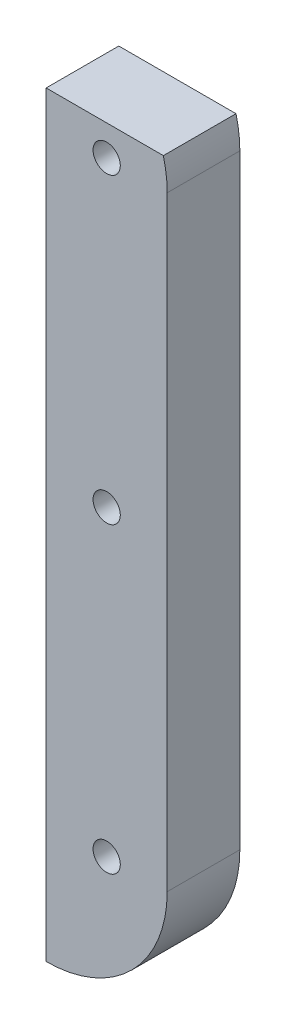
ISO-10303-21;
HEADER;
FILE_DESCRIPTION(('STEP AP214'),'2;1');
FILE_NAME('part.step','',(''),(''),'','','');
FILE_SCHEMA(('AUTOMOTIVE_DESIGN { 1 0 10303 214 1 1 1 1 }'));
ENDSEC;
DATA;
#1=APPLICATION_CONTEXT('core data for automotive mechanical design processes');
#2=APPLICATION_PROTOCOL_DEFINITION('international standard','automotive_design',2000,#1);
#3=PRODUCT_CONTEXT('',#1,'mechanical');
#4=PRODUCT('Part','Part','',(#3));
#5=PRODUCT_RELATED_PRODUCT_CATEGORY('part','',(#4));
#6=PRODUCT_DEFINITION_FORMATION('','',#4);
#7=PRODUCT_DEFINITION_CONTEXT('part definition',#1,'design');
#8=PRODUCT_DEFINITION('design','',#6,#7);
#9=PRODUCT_DEFINITION_SHAPE('','',#8);
#10=(LENGTH_UNIT() NAMED_UNIT(*) SI_UNIT(.MILLI.,.METRE.));
#11=(NAMED_UNIT(*) PLANE_ANGLE_UNIT() SI_UNIT($,.RADIAN.));
#12=(NAMED_UNIT(*) SI_UNIT($,.STERADIAN.) SOLID_ANGLE_UNIT());
#13=UNCERTAINTY_MEASURE_WITH_UNIT(LENGTH_MEASURE(1.E-05),#10,'distance_accuracy_value','');
#14=(GEOMETRIC_REPRESENTATION_CONTEXT(3) GLOBAL_UNCERTAINTY_ASSIGNED_CONTEXT((#13)) GLOBAL_UNIT_ASSIGNED_CONTEXT((#10,
#11,#12)) REPRESENTATION_CONTEXT('',''));
#15=CARTESIAN_POINT('',(0.,0.,0.));
#16=DIRECTION('',(0.,0.,1.));
#17=DIRECTION('',(1.,0.,0.));
#18=AXIS2_PLACEMENT_3D('',#15,#16,#17);
#19=CARTESIAN_POINT('',(0.,0.,12.));
#20=DIRECTION('',(0.,0.,1.));
#21=DIRECTION('',(1.,0.,0.));
#22=AXIS2_PLACEMENT_3D('',#19,#20,#21);
#23=PLANE('',#22);
#24=DIRECTION('',(1.,0.,0.));
#25=VECTOR('',#24,1.);
#26=CARTESIAN_POINT('',(-10.,55.,12.));
#27=LINE('',#26,#25);
#28=CARTESIAN_POINT('',(-10.,55.,12.));
#29=VERTEX_POINT('',#28);
#30=CARTESIAN_POINT('',(9.36491673103709,55.,12.));
#31=VERTEX_POINT('',#30);
#32=EDGE_CURVE('E54',#29,#31,#27,.T.);
#33=ORIENTED_EDGE('',*,*,#32,.F.);
#34=DIRECTION('',(0.,-1.,0.));
#35=VECTOR('',#34,1.);
#36=CARTESIAN_POINT('',(-10.,70.,12.));
#37=LINE('',#36,#35);
#38=CARTESIAN_POINT('',(-9.99999999999999,-70.,12.));
#39=VERTEX_POINT('',#38);
#40=EDGE_CURVE('E100',#29,#39,#37,.T.);
#41=ORIENTED_EDGE('',*,*,#40,.T.);
#42=CARTESIAN_POINT('',(-10.,-50.,12.));
#43=DIRECTION('',(0.,0.,1.));
#44=DIRECTION('',(1.,0.,0.));
#45=AXIS2_PLACEMENT_3D('',#42,#43,#44);
#46=CIRCLE('',#45,20.);
#47=CARTESIAN_POINT('',(10.,-50.,12.));
#48=VERTEX_POINT('',#47);
#49=EDGE_CURVE('E11',#39,#48,#46,.T.);
#50=ORIENTED_EDGE('',*,*,#49,.T.);
#51=DIRECTION('',(0.,1.,0.));
#52=VECTOR('',#51,1.);
#53=CARTESIAN_POINT('',(9.99999999999999,70.0000000000001,12.));
#54=LINE('',#53,#52);
#55=CARTESIAN_POINT('',(9.99999999999999,50.,12.));
#56=VERTEX_POINT('',#55);
#57=EDGE_CURVE('E107',#48,#56,#54,.T.);
#58=ORIENTED_EDGE('',*,*,#57,.T.);
#59=CARTESIAN_POINT('',(-10.,50.,12.));
#60=DIRECTION('',(0.,0.,1.));
#61=DIRECTION('',(1.,0.,0.));
#62=AXIS2_PLACEMENT_3D('',#59,#60,#61);
#63=CIRCLE('',#62,20.);
#64=EDGE_CURVE('E47',#56,#31,#63,.T.);
#65=ORIENTED_EDGE('',*,*,#64,.T.);
#66=EDGE_LOOP('',(#33,#41,#50,#58,#65));
#67=FACE_BOUND('',#66,.T.);
#68=CARTESIAN_POINT('',(0.,0.,12.));
#69=DIRECTION('',(0.,0.,1.));
#70=DIRECTION('',(1.,0.,0.));
#71=AXIS2_PLACEMENT_3D('',#68,#69,#70);
#72=CIRCLE('',#71,2.25);
#73=CARTESIAN_POINT('',(2.24999999999999,0.,12.));
#74=VERTEX_POINT('',#73);
#75=EDGE_CURVE('E138',#74,#74,#72,.T.);
#76=ORIENTED_EDGE('',*,*,#75,.F.);
#77=EDGE_LOOP('',(#76));
#78=FACE_BOUND('',#77,.T.);
#79=CARTESIAN_POINT('',(0.,-50.,12.));
#80=DIRECTION('',(0.,0.,1.));
#81=DIRECTION('',(1.,0.,0.));
#82=AXIS2_PLACEMENT_3D('',#79,#80,#81);
#83=CIRCLE('',#82,2.25);
#84=CARTESIAN_POINT('',(2.24999999999999,-50.,12.));
#85=VERTEX_POINT('',#84);
#86=EDGE_CURVE('E111',#85,#85,#83,.T.);
#87=ORIENTED_EDGE('',*,*,#86,.F.);
#88=EDGE_LOOP('',(#87));
#89=FACE_BOUND('',#88,.T.);
#90=CARTESIAN_POINT('',(0.,50.,12.));
#91=DIRECTION('',(0.,0.,1.));
#92=DIRECTION('',(1.,0.,0.));
#93=AXIS2_PLACEMENT_3D('',#90,#91,#92);
#94=CIRCLE('',#93,2.25);
#95=CARTESIAN_POINT('',(2.24999999999999,50.,12.));
#96=VERTEX_POINT('',#95);
#97=EDGE_CURVE('E131',#96,#96,#94,.T.);
#98=ORIENTED_EDGE('',*,*,#97,.F.);
#99=EDGE_LOOP('',(#98));
#100=FACE_BOUND('',#99,.T.);
#101=ADVANCED_FACE('F39',(#67,#78,#89,#100),#23,.T.);
#102=CARTESIAN_POINT('',(0.,0.,0.));
#103=DIRECTION('',(0.,0.,1.));
#104=DIRECTION('',(1.,0.,0.));
#105=AXIS2_PLACEMENT_3D('',#102,#103,#104);
#106=PLANE('',#105);
#107=DIRECTION('',(0.,-1.,0.));
#108=VECTOR('',#107,1.);
#109=CARTESIAN_POINT('',(-10.,70.,0.));
#110=LINE('',#109,#108);
#111=CARTESIAN_POINT('',(-10.,55.,0.));
#112=VERTEX_POINT('',#111);
#113=CARTESIAN_POINT('',(-9.99999999999999,-70.,0.));
#114=VERTEX_POINT('',#113);
#115=EDGE_CURVE('E98',#112,#114,#110,.T.);
#116=ORIENTED_EDGE('',*,*,#115,.F.);
#117=DIRECTION('',(1.,0.,0.));
#118=VECTOR('',#117,1.);
#119=CARTESIAN_POINT('',(-10.,55.,0.));
#120=LINE('',#119,#118);
#121=CARTESIAN_POINT('',(9.36491673103709,55.,0.));
#122=VERTEX_POINT('',#121);
#123=EDGE_CURVE('E85',#112,#122,#120,.T.);
#124=ORIENTED_EDGE('',*,*,#123,.T.);
#125=CARTESIAN_POINT('',(-10.,50.,0.));
#126=DIRECTION('',(0.,0.,1.));
#127=DIRECTION('',(1.,0.,0.));
#128=AXIS2_PLACEMENT_3D('',#125,#126,#127);
#129=CIRCLE('',#128,20.);
#130=CARTESIAN_POINT('',(9.99999999999999,50.,0.));
#131=VERTEX_POINT('',#130);
#132=EDGE_CURVE('E121',#122,#131,#129,.F.);
#133=ORIENTED_EDGE('',*,*,#132,.T.);
#134=DIRECTION('',(0.,1.,0.));
#135=VECTOR('',#134,1.);
#136=CARTESIAN_POINT('',(9.99999999999999,70.0000000000001,0.));
#137=LINE('',#136,#135);
#138=CARTESIAN_POINT('',(10.,-50.,0.));
#139=VERTEX_POINT('',#138);
#140=EDGE_CURVE('E108',#139,#131,#137,.T.);
#141=ORIENTED_EDGE('',*,*,#140,.F.);
#142=CARTESIAN_POINT('',(-10.,-50.,0.));
#143=DIRECTION('',(0.,0.,1.));
#144=DIRECTION('',(1.,0.,0.));
#145=AXIS2_PLACEMENT_3D('',#142,#143,#144);
#146=CIRCLE('',#145,20.);
#147=EDGE_CURVE('E105',#139,#114,#146,.F.);
#148=ORIENTED_EDGE('',*,*,#147,.T.);
#149=EDGE_LOOP('',(#116,#124,#133,#141,#148));
#150=FACE_BOUND('',#149,.T.);
#151=CARTESIAN_POINT('',(0.,-50.,0.));
#152=DIRECTION('',(0.,0.,1.));
#153=DIRECTION('',(1.,0.,0.));
#154=AXIS2_PLACEMENT_3D('',#151,#152,#153);
#155=CIRCLE('',#154,2.25);
#156=CARTESIAN_POINT('',(2.24999999999999,-50.,0.));
#157=VERTEX_POINT('',#156);
#158=EDGE_CURVE('E141',#157,#157,#155,.T.);
#159=ORIENTED_EDGE('',*,*,#158,.T.);
#160=EDGE_LOOP('',(#159));
#161=FACE_BOUND('',#160,.T.);
#162=CARTESIAN_POINT('',(0.,0.,0.));
#163=DIRECTION('',(0.,0.,1.));
#164=DIRECTION('',(1.,0.,0.));
#165=AXIS2_PLACEMENT_3D('',#162,#163,#164);
#166=CIRCLE('',#165,2.25);
#167=CARTESIAN_POINT('',(2.24999999999999,0.,0.));
#168=VERTEX_POINT('',#167);
#169=EDGE_CURVE('E136',#168,#168,#166,.T.);
#170=ORIENTED_EDGE('',*,*,#169,.T.);
#171=EDGE_LOOP('',(#170));
#172=FACE_BOUND('',#171,.T.);
#173=CARTESIAN_POINT('',(0.,50.,0.));
#174=DIRECTION('',(0.,0.,1.));
#175=DIRECTION('',(1.,0.,0.));
#176=AXIS2_PLACEMENT_3D('',#173,#174,#175);
#177=CIRCLE('',#176,2.25);
#178=CARTESIAN_POINT('',(2.24999999999999,50.,0.));
#179=VERTEX_POINT('',#178);
#180=EDGE_CURVE('E128',#179,#179,#177,.T.);
#181=ORIENTED_EDGE('',*,*,#180,.T.);
#182=EDGE_LOOP('',(#181));
#183=FACE_BOUND('',#182,.T.);
#184=ADVANCED_FACE('F102',(#150,#161,#172,#183),#106,.F.);
#185=CARTESIAN_POINT('',(9.99999999999999,70.0000000000001,12.));
#186=DIRECTION('',(-1.,0.,0.));
#187=DIRECTION('',(0.,-1.,0.));
#188=AXIS2_PLACEMENT_3D('',#185,#186,#187);
#189=PLANE('',#188);
#190=ORIENTED_EDGE('',*,*,#57,.F.);
#191=DIRECTION('',(0.,0.,-1.));
#192=VECTOR('',#191,1.);
#193=CARTESIAN_POINT('',(10.,-50.,12.));
#194=LINE('',#193,#192);
#195=EDGE_CURVE('E118',#48,#139,#194,.T.);
#196=ORIENTED_EDGE('',*,*,#195,.T.);
#197=ORIENTED_EDGE('',*,*,#140,.T.);
#198=DIRECTION('',(0.,0.,-1.));
#199=VECTOR('',#198,1.);
#200=CARTESIAN_POINT('',(9.99999999999999,50.,12.));
#201=LINE('',#200,#199);
#202=EDGE_CURVE('E62',#131,#56,#201,.F.);
#203=ORIENTED_EDGE('',*,*,#202,.T.);
#204=EDGE_LOOP('',(#190,#196,#197,#203));
#205=FACE_BOUND('',#204,.T.);
#206=ADVANCED_FACE('F151',(#205),#189,.F.);
#207=CARTESIAN_POINT('',(-10.,70.,12.));
#208=DIRECTION('',(1.,0.,0.));
#209=DIRECTION('',(0.,1.,0.));
#210=AXIS2_PLACEMENT_3D('',#207,#208,#209);
#211=PLANE('',#210);
#212=ORIENTED_EDGE('',*,*,#40,.F.);
#213=DIRECTION('',(0.,0.,1.));
#214=VECTOR('',#213,1.);
#215=CARTESIAN_POINT('',(-10.,55.,0.));
#216=LINE('',#215,#214);
#217=EDGE_CURVE('E88',#112,#29,#216,.T.);
#218=ORIENTED_EDGE('',*,*,#217,.F.);
#219=ORIENTED_EDGE('',*,*,#115,.T.);
#220=DIRECTION('',(0.,0.,-1.));
#221=VECTOR('',#220,1.);
#222=CARTESIAN_POINT('',(-9.99999999999999,-70.,12.));
#223=LINE('',#222,#221);
#224=EDGE_CURVE('E115',#39,#114,#223,.T.);
#225=ORIENTED_EDGE('',*,*,#224,.F.);
#226=EDGE_LOOP('',(#212,#218,#219,#225));
#227=FACE_BOUND('',#226,.T.);
#228=ADVANCED_FACE('F96',(#227),#211,.F.);
#229=CARTESIAN_POINT('',(0.,-50.,12.));
#230=DIRECTION('',(0.,0.,-1.));
#231=DIRECTION('',(-1.,0.,0.));
#232=AXIS2_PLACEMENT_3D('',#229,#230,#231);
#233=CYLINDRICAL_SURFACE('',#232,2.25);
#234=ORIENTED_EDGE('',*,*,#86,.T.);
#235=EDGE_LOOP('',(#234));
#236=FACE_BOUND('',#235,.T.);
#237=ORIENTED_EDGE('',*,*,#158,.F.);
#238=EDGE_LOOP('',(#237));
#239=FACE_BOUND('',#238,.T.);
#240=ADVANCED_FACE('F159',(#236,#239),#233,.F.);
#241=CARTESIAN_POINT('',(0.,0.,12.));
#242=DIRECTION('',(0.,0.,-1.));
#243=DIRECTION('',(-1.,0.,0.));
#244=AXIS2_PLACEMENT_3D('',#241,#242,#243);
#245=CYLINDRICAL_SURFACE('',#244,2.25);
#246=ORIENTED_EDGE('',*,*,#75,.T.);
#247=EDGE_LOOP('',(#246));
#248=FACE_BOUND('',#247,.T.);
#249=ORIENTED_EDGE('',*,*,#169,.F.);
#250=EDGE_LOOP('',(#249));
#251=FACE_BOUND('',#250,.T.);
#252=ADVANCED_FACE('F170',(#248,#251),#245,.F.);
#253=CARTESIAN_POINT('',(0.,50.,12.));
#254=DIRECTION('',(0.,0.,-1.));
#255=DIRECTION('',(-1.,0.,0.));
#256=AXIS2_PLACEMENT_3D('',#253,#254,#255);
#257=CYLINDRICAL_SURFACE('',#256,2.25);
#258=ORIENTED_EDGE('',*,*,#97,.T.);
#259=EDGE_LOOP('',(#258));
#260=FACE_BOUND('',#259,.T.);
#261=ORIENTED_EDGE('',*,*,#180,.F.);
#262=EDGE_LOOP('',(#261));
#263=FACE_BOUND('',#262,.T.);
#264=ADVANCED_FACE('F174',(#260,#263),#257,.F.);
#265=CARTESIAN_POINT('',(-10.,-50.,12.));
#266=DIRECTION('',(0.,0.,-1.));
#267=DIRECTION('',(-1.,0.,0.));
#268=AXIS2_PLACEMENT_3D('',#265,#266,#267);
#269=CYLINDRICAL_SURFACE('',#268,20.);
#270=ORIENTED_EDGE('',*,*,#49,.F.);
#271=ORIENTED_EDGE('',*,*,#224,.T.);
#272=ORIENTED_EDGE('',*,*,#147,.F.);
#273=ORIENTED_EDGE('',*,*,#195,.F.);
#274=EDGE_LOOP('',(#270,#271,#272,#273));
#275=FACE_BOUND('',#274,.T.);
#276=ADVANCED_FACE('F150',(#275),#269,.T.);
#277=CARTESIAN_POINT('',(-10.,50.,12.));
#278=DIRECTION('',(0.,0.,-1.));
#279=DIRECTION('',(-1.,0.,0.));
#280=AXIS2_PLACEMENT_3D('',#277,#278,#279);
#281=CYLINDRICAL_SURFACE('',#280,20.);
#282=DIRECTION('',(0.,0.,1.));
#283=VECTOR('',#282,1.);
#284=CARTESIAN_POINT('',(9.36491673103709,55.,0.));
#285=LINE('',#284,#283);
#286=EDGE_CURVE('E89',#122,#31,#285,.T.);
#287=ORIENTED_EDGE('',*,*,#286,.T.);
#288=ORIENTED_EDGE('',*,*,#64,.F.);
#289=ORIENTED_EDGE('',*,*,#202,.F.);
#290=ORIENTED_EDGE('',*,*,#132,.F.);
#291=EDGE_LOOP('',(#287,#288,#289,#290));
#292=FACE_BOUND('',#291,.T.);
#293=ADVANCED_FACE('F41',(#292),#281,.T.);
#294=CARTESIAN_POINT('',(-10.,55.,0.));
#295=DIRECTION('',(0.,-1.,0.));
#296=DIRECTION('',(0.,0.,-1.));
#297=AXIS2_PLACEMENT_3D('',#294,#295,#296);
#298=PLANE('',#297);
#299=ORIENTED_EDGE('',*,*,#32,.T.);
#300=ORIENTED_EDGE('',*,*,#286,.F.);
#301=ORIENTED_EDGE('',*,*,#123,.F.);
#302=ORIENTED_EDGE('',*,*,#217,.T.);
#303=EDGE_LOOP('',(#299,#300,#301,#302));
#304=FACE_BOUND('',#303,.T.);
#305=ADVANCED_FACE('F87',(#304),#298,.F.);
#306=CLOSED_SHELL('',(#101,#184,#206,#228,#240,#252,#264,#276,#293,#305));
#307=MANIFOLD_SOLID_BREP('B2',#306);
#308=ADVANCED_BREP_SHAPE_REPRESENTATION('',(#18,#307),#14);
#309=SHAPE_DEFINITION_REPRESENTATION(#9,#308);
ENDSEC;
END-ISO-10303-21;
